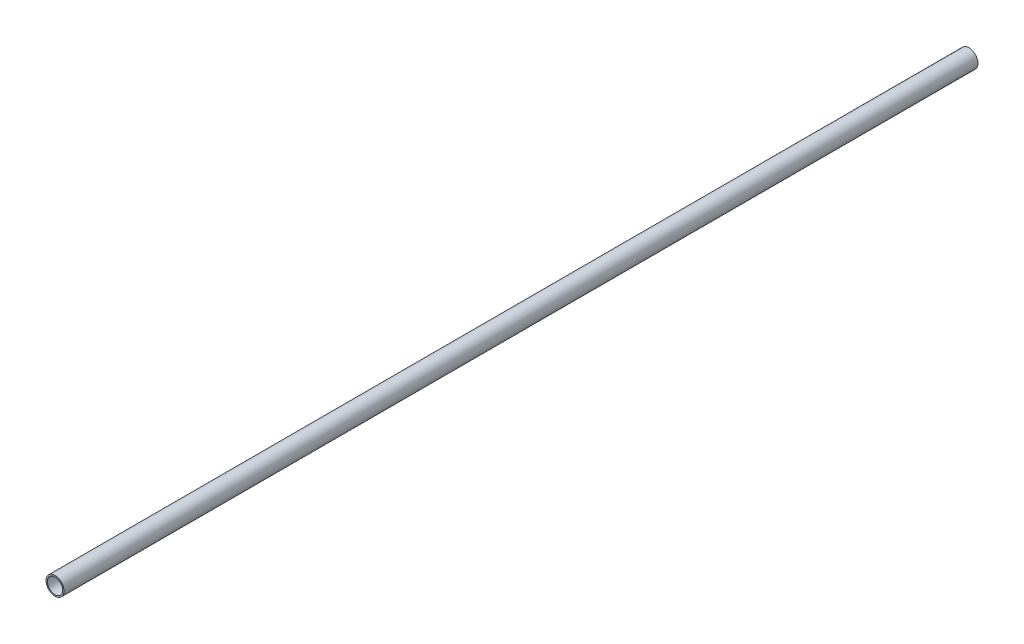
ISO-10303-21;
HEADER;
FILE_DESCRIPTION(('STEP AP214'),'2;1');
FILE_NAME('part.step','',(''),(''),'','','');
FILE_SCHEMA(('AUTOMOTIVE_DESIGN { 1 0 10303 214 1 1 1 1 }'));
ENDSEC;
DATA;
#1=APPLICATION_CONTEXT('core data for automotive mechanical design processes');
#2=APPLICATION_PROTOCOL_DEFINITION('international standard','automotive_design',2000,#1);
#3=PRODUCT_CONTEXT('',#1,'mechanical');
#4=PRODUCT('Part','Part','',(#3));
#5=PRODUCT_RELATED_PRODUCT_CATEGORY('part','',(#4));
#6=PRODUCT_DEFINITION_FORMATION('','',#4);
#7=PRODUCT_DEFINITION_CONTEXT('part definition',#1,'design');
#8=PRODUCT_DEFINITION('design','',#6,#7);
#9=PRODUCT_DEFINITION_SHAPE('','',#8);
#10=(LENGTH_UNIT() NAMED_UNIT(*) SI_UNIT(.MILLI.,.METRE.));
#11=(NAMED_UNIT(*) PLANE_ANGLE_UNIT() SI_UNIT($,.RADIAN.));
#12=(NAMED_UNIT(*) SI_UNIT($,.STERADIAN.) SOLID_ANGLE_UNIT());
#13=UNCERTAINTY_MEASURE_WITH_UNIT(LENGTH_MEASURE(1.E-05),#10,'distance_accuracy_value','');
#14=(GEOMETRIC_REPRESENTATION_CONTEXT(3) GLOBAL_UNCERTAINTY_ASSIGNED_CONTEXT((#13)) GLOBAL_UNIT_ASSIGNED_CONTEXT((#10,
#11,#12)) REPRESENTATION_CONTEXT('',''));
#15=CARTESIAN_POINT('',(0.,0.,0.));
#16=DIRECTION('',(0.,0.,1.));
#17=DIRECTION('',(1.,0.,0.));
#18=AXIS2_PLACEMENT_3D('',#15,#16,#17);
#19=CARTESIAN_POINT('',(0.,0.,800.));
#20=DIRECTION('',(0.,0.,1.));
#21=DIRECTION('',(1.,0.,0.));
#22=AXIS2_PLACEMENT_3D('',#19,#20,#21);
#23=PLANE('',#22);
#24=CARTESIAN_POINT('',(0.,0.,800.));
#25=DIRECTION('',(0.,0.,1.));
#26=DIRECTION('',(1.,0.,0.));
#27=AXIS2_PLACEMENT_3D('',#24,#25,#26);
#28=CIRCLE('',#27,7.9);
#29=CARTESIAN_POINT('',(7.9,0.,800.));
#30=VERTEX_POINT('',#29);
#31=EDGE_CURVE('E10',#30,#30,#28,.T.);
#32=ORIENTED_EDGE('',*,*,#31,.T.);
#33=EDGE_LOOP('',(#32));
#34=FACE_BOUND('',#33,.T.);
#35=CARTESIAN_POINT('',(0.,0.,800.));
#36=DIRECTION('',(0.,0.,1.));
#37=DIRECTION('',(1.,0.,0.));
#38=AXIS2_PLACEMENT_3D('',#35,#36,#37);
#39=CIRCLE('',#38,6.7);
#40=CARTESIAN_POINT('',(6.7,0.,800.));
#41=VERTEX_POINT('',#40);
#42=EDGE_CURVE('E52',#41,#41,#39,.T.);
#43=ORIENTED_EDGE('',*,*,#42,.F.);
#44=EDGE_LOOP('',(#43));
#45=FACE_BOUND('',#44,.T.);
#46=ADVANCED_FACE('F41',(#34,#45),#23,.T.);
#47=CARTESIAN_POINT('',(0.,0.,0.));
#48=DIRECTION('',(0.,0.,1.));
#49=DIRECTION('',(1.,0.,0.));
#50=AXIS2_PLACEMENT_3D('',#47,#48,#49);
#51=PLANE('',#50);
#52=CARTESIAN_POINT('',(0.,0.,0.));
#53=DIRECTION('',(0.,0.,1.));
#54=DIRECTION('',(1.,0.,0.));
#55=AXIS2_PLACEMENT_3D('',#52,#53,#54);
#56=CIRCLE('',#55,7.9);
#57=CARTESIAN_POINT('',(7.9,0.,0.));
#58=VERTEX_POINT('',#57);
#59=EDGE_CURVE('E45',#58,#58,#56,.T.);
#60=ORIENTED_EDGE('',*,*,#59,.F.);
#61=EDGE_LOOP('',(#60));
#62=FACE_BOUND('',#61,.T.);
#63=CARTESIAN_POINT('',(0.,0.,0.));
#64=DIRECTION('',(0.,0.,1.));
#65=DIRECTION('',(1.,0.,0.));
#66=AXIS2_PLACEMENT_3D('',#63,#64,#65);
#67=CIRCLE('',#66,6.7);
#68=CARTESIAN_POINT('',(6.7,0.,0.));
#69=VERTEX_POINT('',#68);
#70=EDGE_CURVE('E54',#69,#69,#67,.T.);
#71=ORIENTED_EDGE('',*,*,#70,.T.);
#72=EDGE_LOOP('',(#71));
#73=FACE_BOUND('',#72,.T.);
#74=ADVANCED_FACE('F64',(#62,#73),#51,.F.);
#75=CARTESIAN_POINT('',(0.,0.,800.));
#76=DIRECTION('',(0.,0.,-1.));
#77=DIRECTION('',(-1.,0.,0.));
#78=AXIS2_PLACEMENT_3D('',#75,#76,#77);
#79=CYLINDRICAL_SURFACE('',#78,7.9);
#80=ORIENTED_EDGE('',*,*,#31,.F.);
#81=EDGE_LOOP('',(#80));
#82=FACE_BOUND('',#81,.T.);
#83=ORIENTED_EDGE('',*,*,#59,.T.);
#84=EDGE_LOOP('',(#83));
#85=FACE_BOUND('',#84,.T.);
#86=ADVANCED_FACE('F43',(#82,#85),#79,.T.);
#87=CARTESIAN_POINT('',(0.,0.,800.));
#88=DIRECTION('',(0.,0.,-1.));
#89=DIRECTION('',(-1.,0.,0.));
#90=AXIS2_PLACEMENT_3D('',#87,#88,#89);
#91=CYLINDRICAL_SURFACE('',#90,6.7);
#92=ORIENTED_EDGE('',*,*,#42,.T.);
#93=EDGE_LOOP('',(#92));
#94=FACE_BOUND('',#93,.T.);
#95=ORIENTED_EDGE('',*,*,#70,.F.);
#96=EDGE_LOOP('',(#95));
#97=FACE_BOUND('',#96,.T.);
#98=ADVANCED_FACE('F60',(#94,#97),#91,.F.);
#99=CLOSED_SHELL('',(#46,#74,#86,#98));
#100=MANIFOLD_SOLID_BREP('B2',#99);
#101=ADVANCED_BREP_SHAPE_REPRESENTATION('',(#18,#100),#14);
#102=SHAPE_DEFINITION_REPRESENTATION(#9,#101);
ENDSEC;
END-ISO-10303-21;
